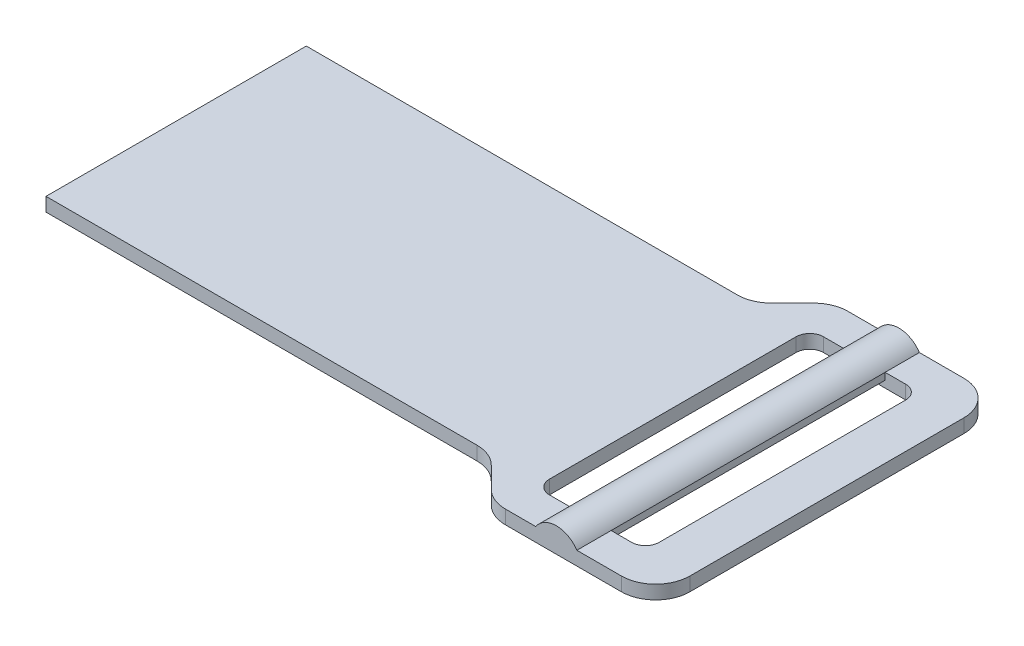
ISO-10303-21;
HEADER;
FILE_DESCRIPTION(('STEP AP214'),'2;1');
FILE_NAME('part.step','',(''),(''),'','','');
FILE_SCHEMA(('AUTOMOTIVE_DESIGN { 1 0 10303 214 1 1 1 1 }'));
ENDSEC;
DATA;
#1=APPLICATION_CONTEXT('core data for automotive mechanical design processes');
#2=APPLICATION_PROTOCOL_DEFINITION('international standard','automotive_design',2000,#1);
#3=PRODUCT_CONTEXT('',#1,'mechanical');
#4=PRODUCT('Part','Part','',(#3));
#5=PRODUCT_RELATED_PRODUCT_CATEGORY('part','',(#4));
#6=PRODUCT_DEFINITION_FORMATION('','',#4);
#7=PRODUCT_DEFINITION_CONTEXT('part definition',#1,'design');
#8=PRODUCT_DEFINITION('design','',#6,#7);
#9=PRODUCT_DEFINITION_SHAPE('','',#8);
#10=(LENGTH_UNIT() NAMED_UNIT(*) SI_UNIT(.MILLI.,.METRE.));
#11=(NAMED_UNIT(*) PLANE_ANGLE_UNIT() SI_UNIT($,.RADIAN.));
#12=(NAMED_UNIT(*) SI_UNIT($,.STERADIAN.) SOLID_ANGLE_UNIT());
#13=UNCERTAINTY_MEASURE_WITH_UNIT(LENGTH_MEASURE(1.E-05),#10,'distance_accuracy_value','');
#14=(GEOMETRIC_REPRESENTATION_CONTEXT(3) GLOBAL_UNCERTAINTY_ASSIGNED_CONTEXT((#13)) GLOBAL_UNIT_ASSIGNED_CONTEXT((#10,
#11,#12)) REPRESENTATION_CONTEXT('',''));
#15=CARTESIAN_POINT('',(0.,0.,0.));
#16=DIRECTION('',(0.,0.,1.));
#17=DIRECTION('',(1.,0.,0.));
#18=AXIS2_PLACEMENT_3D('',#15,#16,#17);
#19=CARTESIAN_POINT('',(0.,2.,0.));
#20=DIRECTION('',(0.,1.,0.));
#21=DIRECTION('',(0.,0.,1.));
#22=AXIS2_PLACEMENT_3D('',#19,#20,#21);
#23=PLANE('',#22);
#24=DIRECTION('',(-1.,0.,0.));
#25=VECTOR('',#24,1.);
#26=CARTESIAN_POINT('',(62.5,2.,-25.));
#27=LINE('',#26,#25);
#28=CARTESIAN_POINT('',(57.5,2.,-25.));
#29=VERTEX_POINT('',#28);
#30=CARTESIAN_POINT('',(51.,2.,-25.));
#31=VERTEX_POINT('',#30);
#32=EDGE_CURVE('E283',#29,#31,#27,.T.);
#33=ORIENTED_EDGE('',*,*,#32,.T.);
#34=DIRECTION('',(0.,0.,-1.));
#35=VECTOR('',#34,1.);
#36=CARTESIAN_POINT('',(51.,2.,25.));
#37=LINE('',#36,#35);
#38=CARTESIAN_POINT('',(51.,2.,-20.));
#39=VERTEX_POINT('',#38);
#40=EDGE_CURVE('E262',#39,#31,#37,.T.);
#41=ORIENTED_EDGE('',*,*,#40,.F.);
#42=DIRECTION('',(-1.,0.,0.));
#43=VECTOR('',#42,1.);
#44=CARTESIAN_POINT('',(56.,2.,-20.));
#45=LINE('',#44,#43);
#46=CARTESIAN_POINT('',(54.,2.,-20.));
#47=VERTEX_POINT('',#46);
#48=EDGE_CURVE('E302',#47,#39,#45,.T.);
#49=ORIENTED_EDGE('',*,*,#48,.F.);
#50=CARTESIAN_POINT('',(54.,2.,-18.));
#51=DIRECTION('',(0.,1.,0.));
#52=DIRECTION('',(0.,0.,1.));
#53=AXIS2_PLACEMENT_3D('',#50,#51,#52);
#54=CIRCLE('',#53,2.);
#55=CARTESIAN_POINT('',(56.,2.,-18.));
#56=VERTEX_POINT('',#55);
#57=EDGE_CURVE('E450',#47,#56,#54,.F.);
#58=ORIENTED_EDGE('',*,*,#57,.T.);
#59=DIRECTION('',(0.,0.,-1.));
#60=VECTOR('',#59,1.);
#61=CARTESIAN_POINT('',(56.,2.,20.));
#62=LINE('',#61,#60);
#63=CARTESIAN_POINT('',(56.,2.,18.));
#64=VERTEX_POINT('',#63);
#65=EDGE_CURVE('E530',#64,#56,#62,.T.);
#66=ORIENTED_EDGE('',*,*,#65,.F.);
#67=CARTESIAN_POINT('',(54.,2.,18.));
#68=DIRECTION('',(0.,1.,0.));
#69=DIRECTION('',(0.,0.,1.));
#70=AXIS2_PLACEMENT_3D('',#67,#68,#69);
#71=CIRCLE('',#70,2.);
#72=CARTESIAN_POINT('',(54.,2.,20.));
#73=VERTEX_POINT('',#72);
#74=EDGE_CURVE('E444',#64,#73,#71,.F.);
#75=ORIENTED_EDGE('',*,*,#74,.T.);
#76=DIRECTION('',(1.,0.,0.));
#77=VECTOR('',#76,1.);
#78=CARTESIAN_POINT('',(56.,2.,20.));
#79=LINE('',#78,#77);
#80=CARTESIAN_POINT('',(51.,2.,20.));
#81=VERTEX_POINT('',#80);
#82=EDGE_CURVE('E257',#81,#73,#79,.T.);
#83=ORIENTED_EDGE('',*,*,#82,.F.);
#84=CARTESIAN_POINT('',(51.,2.,25.));
#85=VERTEX_POINT('',#84);
#86=EDGE_CURVE('E240',#85,#81,#37,.T.);
#87=ORIENTED_EDGE('',*,*,#86,.F.);
#88=DIRECTION('',(1.,0.,0.));
#89=VECTOR('',#88,1.);
#90=CARTESIAN_POINT('',(38.5,2.,25.));
#91=LINE('',#90,#89);
#92=CARTESIAN_POINT('',(57.5,2.,25.));
#93=VERTEX_POINT('',#92);
#94=EDGE_CURVE('E254',#85,#93,#91,.T.);
#95=ORIENTED_EDGE('',*,*,#94,.T.);
#96=CARTESIAN_POINT('',(57.5,2.,20.));
#97=DIRECTION('',(0.,1.,0.));
#98=DIRECTION('',(0.,0.,1.));
#99=AXIS2_PLACEMENT_3D('',#96,#97,#98);
#100=CIRCLE('',#99,5.);
#101=CARTESIAN_POINT('',(62.5,2.,20.));
#102=VERTEX_POINT('',#101);
#103=EDGE_CURVE('E363',#93,#102,#100,.T.);
#104=ORIENTED_EDGE('',*,*,#103,.T.);
#105=DIRECTION('',(0.,0.,-1.));
#106=VECTOR('',#105,1.);
#107=CARTESIAN_POINT('',(62.5,2.,25.));
#108=LINE('',#107,#106);
#109=CARTESIAN_POINT('',(62.5,2.,-20.));
#110=VERTEX_POINT('',#109);
#111=EDGE_CURVE('E273',#102,#110,#108,.T.);
#112=ORIENTED_EDGE('',*,*,#111,.T.);
#113=CARTESIAN_POINT('',(57.5,2.,-20.));
#114=DIRECTION('',(0.,1.,0.));
#115=DIRECTION('',(0.,0.,1.));
#116=AXIS2_PLACEMENT_3D('',#113,#114,#115);
#117=CIRCLE('',#116,5.);
#118=EDGE_CURVE('E366',#110,#29,#117,.T.);
#119=ORIENTED_EDGE('',*,*,#118,.T.);
#120=EDGE_LOOP('',(#33,#41,#49,#58,#66,#75,#83,#87,#95,#104,#112,#119));
#121=FACE_BOUND('',#120,.T.);
#122=ADVANCED_FACE('F39',(#121),#23,.T.);
#123=CARTESIAN_POINT('',(40.5710678118655,2.,25.));
#124=VERTEX_POINT('',#123);
#125=CARTESIAN_POINT('',(45.,2.,25.));
#126=VERTEX_POINT('',#125);
#127=EDGE_CURVE('E268',#124,#126,#91,.T.);
#128=ORIENTED_EDGE('',*,*,#127,.T.);
#129=DIRECTION('',(0.,0.,-1.));
#130=VECTOR('',#129,1.);
#131=CARTESIAN_POINT('',(45.,2.,25.));
#132=LINE('',#131,#130);
#133=CARTESIAN_POINT('',(45.,2.,20.));
#134=VERTEX_POINT('',#133);
#135=EDGE_CURVE('E243',#126,#134,#132,.T.);
#136=ORIENTED_EDGE('',*,*,#135,.T.);
#137=CARTESIAN_POINT('',(42.,2.,20.));
#138=VERTEX_POINT('',#137);
#139=EDGE_CURVE('E526',#138,#134,#79,.T.);
#140=ORIENTED_EDGE('',*,*,#139,.F.);
#141=CARTESIAN_POINT('',(42.,2.,18.));
#142=DIRECTION('',(0.,1.,0.));
#143=DIRECTION('',(0.,0.,1.));
#144=AXIS2_PLACEMENT_3D('',#141,#142,#143);
#145=CIRCLE('',#144,2.);
#146=CARTESIAN_POINT('',(40.,2.,18.));
#147=VERTEX_POINT('',#146);
#148=EDGE_CURVE('E456',#138,#147,#145,.F.);
#149=ORIENTED_EDGE('',*,*,#148,.T.);
#150=DIRECTION('',(0.,0.,1.));
#151=VECTOR('',#150,1.);
#152=CARTESIAN_POINT('',(40.,2.,20.));
#153=LINE('',#152,#151);
#154=CARTESIAN_POINT('',(40.,2.,-18.));
#155=VERTEX_POINT('',#154);
#156=EDGE_CURVE('E521',#155,#147,#153,.T.);
#157=ORIENTED_EDGE('',*,*,#156,.F.);
#158=CARTESIAN_POINT('',(42.,2.,-18.));
#159=DIRECTION('',(0.,1.,0.));
#160=DIRECTION('',(0.,0.,1.));
#161=AXIS2_PLACEMENT_3D('',#158,#159,#160);
#162=CIRCLE('',#161,2.);
#163=CARTESIAN_POINT('',(42.,2.,-20.));
#164=VERTEX_POINT('',#163);
#165=EDGE_CURVE('E462',#155,#164,#162,.F.);
#166=ORIENTED_EDGE('',*,*,#165,.T.);
#167=CARTESIAN_POINT('',(45.,2.,-20.));
#168=VERTEX_POINT('',#167);
#169=EDGE_CURVE('E534',#168,#164,#45,.T.);
#170=ORIENTED_EDGE('',*,*,#169,.F.);
#171=CARTESIAN_POINT('',(45.,2.,-25.));
#172=VERTEX_POINT('',#171);
#173=EDGE_CURVE('E493',#168,#172,#132,.T.);
#174=ORIENTED_EDGE('',*,*,#173,.T.);
#175=CARTESIAN_POINT('',(40.5710678118655,2.,-25.));
#176=VERTEX_POINT('',#175);
#177=EDGE_CURVE('E282',#172,#176,#27,.T.);
#178=ORIENTED_EDGE('',*,*,#177,.T.);
#179=CARTESIAN_POINT('',(40.5710678118655,2.,-20.));
#180=DIRECTION('',(0.,1.,0.));
#181=DIRECTION('',(0.,0.,1.));
#182=AXIS2_PLACEMENT_3D('',#179,#180,#181);
#183=CIRCLE('',#182,5.);
#184=CARTESIAN_POINT('',(37.0355339059327,2.,-23.5355339059327));
#185=VERTEX_POINT('',#184);
#186=EDGE_CURVE('E369',#176,#185,#183,.T.);
#187=ORIENTED_EDGE('',*,*,#186,.T.);
#188=DIRECTION('',(-0.707106781186547,0.,0.707106781186548));
#189=VECTOR('',#188,1.);
#190=CARTESIAN_POINT('',(38.5,2.,-25.));
#191=LINE('',#190,#189);
#192=CARTESIAN_POINT('',(33.9644660940673,2.,-20.4644660940673));
#193=VERTEX_POINT('',#192);
#194=EDGE_CURVE('E286',#185,#193,#191,.T.);
#195=ORIENTED_EDGE('',*,*,#194,.T.);
#196=CARTESIAN_POINT('',(30.4289321881345,2.,-24.));
#197=DIRECTION('',(0.,1.,0.));
#198=DIRECTION('',(0.,0.,1.));
#199=AXIS2_PLACEMENT_3D('',#196,#197,#198);
#200=CIRCLE('',#199,5.);
#201=CARTESIAN_POINT('',(30.4289321881345,2.,-19.));
#202=VERTEX_POINT('',#201);
#203=EDGE_CURVE('E410',#193,#202,#200,.F.);
#204=ORIENTED_EDGE('',*,*,#203,.T.);
#205=DIRECTION('',(-1.,0.,0.));
#206=VECTOR('',#205,1.);
#207=CARTESIAN_POINT('',(-32.5,2.,-19.));
#208=LINE('',#207,#206);
#209=CARTESIAN_POINT('',(-32.5,2.,-19.));
#210=VERTEX_POINT('',#209);
#211=EDGE_CURVE('E290',#202,#210,#208,.T.);
#212=ORIENTED_EDGE('',*,*,#211,.T.);
#213=DIRECTION('',(0.,0.,1.));
#214=VECTOR('',#213,1.);
#215=CARTESIAN_POINT('',(-32.5,2.,-19.));
#216=LINE('',#215,#214);
#217=CARTESIAN_POINT('',(-32.5,2.,19.));
#218=VERTEX_POINT('',#217);
#219=EDGE_CURVE('E293',#210,#218,#216,.T.);
#220=ORIENTED_EDGE('',*,*,#219,.T.);
#221=DIRECTION('',(1.,0.,0.));
#222=VECTOR('',#221,1.);
#223=CARTESIAN_POINT('',(-32.5,2.,19.));
#224=LINE('',#223,#222);
#225=CARTESIAN_POINT('',(30.4289321881345,2.,19.));
#226=VERTEX_POINT('',#225);
#227=EDGE_CURVE('E275',#218,#226,#224,.T.);
#228=ORIENTED_EDGE('',*,*,#227,.T.);
#229=CARTESIAN_POINT('',(30.4289321881345,2.,24.));
#230=DIRECTION('',(0.,1.,0.));
#231=DIRECTION('',(0.,0.,1.));
#232=AXIS2_PLACEMENT_3D('',#229,#230,#231);
#233=CIRCLE('',#232,5.);
#234=CARTESIAN_POINT('',(33.9644660940673,2.,20.4644660940673));
#235=VERTEX_POINT('',#234);
#236=EDGE_CURVE('E404',#226,#235,#233,.F.);
#237=ORIENTED_EDGE('',*,*,#236,.T.);
#238=DIRECTION('',(0.707106781186547,0.,0.707106781186548));
#239=VECTOR('',#238,1.);
#240=CARTESIAN_POINT('',(32.5,2.,19.));
#241=LINE('',#240,#239);
#242=CARTESIAN_POINT('',(37.0355339059327,2.,23.5355339059327));
#243=VERTEX_POINT('',#242);
#244=EDGE_CURVE('E269',#235,#243,#241,.T.);
#245=ORIENTED_EDGE('',*,*,#244,.T.);
#246=CARTESIAN_POINT('',(40.5710678118655,2.,20.));
#247=DIRECTION('',(0.,1.,0.));
#248=DIRECTION('',(0.,0.,1.));
#249=AXIS2_PLACEMENT_3D('',#246,#247,#248);
#250=CIRCLE('',#249,5.);
#251=EDGE_CURVE('E372',#243,#124,#250,.T.);
#252=ORIENTED_EDGE('',*,*,#251,.T.);
#253=EDGE_LOOP('',(#128,#136,#140,#149,#157,#166,#170,#174,#178,#187,#195,#204,#212,#220,#228,
#237,#245,#252));
#254=FACE_BOUND('',#253,.T.);
#255=ADVANCED_FACE('F556',(#254),#23,.T.);
#256=CARTESIAN_POINT('',(56.,2.,20.));
#257=DIRECTION('',(0.,0.,-1.));
#258=DIRECTION('',(-1.,0.,0.));
#259=AXIS2_PLACEMENT_3D('',#256,#257,#258);
#260=PLANE('',#259);
#261=DIRECTION('',(1.,0.,0.));
#262=VECTOR('',#261,1.);
#263=CARTESIAN_POINT('',(56.,0.,20.));
#264=LINE('',#263,#262);
#265=CARTESIAN_POINT('',(50.,0.,20.));
#266=VERTEX_POINT('',#265);
#267=CARTESIAN_POINT('',(54.,0.,20.));
#268=VERTEX_POINT('',#267);
#269=EDGE_CURVE('E540',#266,#268,#264,.T.);
#270=ORIENTED_EDGE('',*,*,#269,.F.);
#271=DIRECTION('',(0.707106781186548,0.707106781186547,0.));
#272=VECTOR('',#271,1.);
#273=CARTESIAN_POINT('',(54.,4.,20.));
#274=LINE('',#273,#272);
#275=CARTESIAN_POINT('',(51.,1.,20.));
#276=VERTEX_POINT('',#275);
#277=EDGE_CURVE('E512',#266,#276,#274,.T.);
#278=ORIENTED_EDGE('',*,*,#277,.T.);
#279=DIRECTION('',(0.,1.,0.));
#280=VECTOR('',#279,1.);
#281=CARTESIAN_POINT('',(51.,2.,20.));
#282=LINE('',#281,#280);
#283=EDGE_CURVE('E509',#276,#81,#282,.T.);
#284=ORIENTED_EDGE('',*,*,#283,.T.);
#285=ORIENTED_EDGE('',*,*,#82,.T.);
#286=DIRECTION('',(0.,-1.,0.));
#287=VECTOR('',#286,1.);
#288=CARTESIAN_POINT('',(54.,0.,20.));
#289=LINE('',#288,#287);
#290=EDGE_CURVE('E416',#73,#268,#289,.T.);
#291=ORIENTED_EDGE('',*,*,#290,.T.);
#292=EDGE_LOOP('',(#270,#278,#284,#285,#291));
#293=FACE_BOUND('',#292,.T.);
#294=ADVANCED_FACE('F614',(#293),#260,.T.);
#295=DIRECTION('',(0.,-1.,0.));
#296=VECTOR('',#295,1.);
#297=CARTESIAN_POINT('',(45.,2.,20.));
#298=LINE('',#297,#296);
#299=CARTESIAN_POINT('',(45.,1.,20.));
#300=VERTEX_POINT('',#299);
#301=EDGE_CURVE('E505',#134,#300,#298,.T.);
#302=ORIENTED_EDGE('',*,*,#301,.T.);
#303=DIRECTION('',(0.707106781186548,-0.707106781186547,0.));
#304=VECTOR('',#303,1.);
#305=CARTESIAN_POINT('',(50.,-4.00000000000001,20.));
#306=LINE('',#305,#304);
#307=CARTESIAN_POINT('',(46.,0.,20.));
#308=VERTEX_POINT('',#307);
#309=EDGE_CURVE('E516',#300,#308,#306,.T.);
#310=ORIENTED_EDGE('',*,*,#309,.T.);
#311=CARTESIAN_POINT('',(42.,0.,20.));
#312=VERTEX_POINT('',#311);
#313=EDGE_CURVE('E541',#312,#308,#264,.T.);
#314=ORIENTED_EDGE('',*,*,#313,.F.);
#315=DIRECTION('',(0.,-1.,0.));
#316=VECTOR('',#315,1.);
#317=CARTESIAN_POINT('',(42.,2.,20.));
#318=LINE('',#317,#316);
#319=EDGE_CURVE('E413',#312,#138,#318,.F.);
#320=ORIENTED_EDGE('',*,*,#319,.T.);
#321=ORIENTED_EDGE('',*,*,#139,.T.);
#322=EDGE_LOOP('',(#302,#310,#314,#320,#321));
#323=FACE_BOUND('',#322,.T.);
#324=ADVANCED_FACE('F580',(#323),#260,.T.);
#325=CARTESIAN_POINT('',(56.,2.,-20.));
#326=DIRECTION('',(0.,0.,1.));
#327=DIRECTION('',(1.,0.,0.));
#328=AXIS2_PLACEMENT_3D('',#325,#326,#327);
#329=PLANE('',#328);
#330=DIRECTION('',(0.,-1.,0.));
#331=VECTOR('',#330,1.);
#332=CARTESIAN_POINT('',(51.,2.,-20.));
#333=LINE('',#332,#331);
#334=CARTESIAN_POINT('',(51.,1.,-20.));
#335=VERTEX_POINT('',#334);
#336=EDGE_CURVE('E48',#39,#335,#333,.T.);
#337=ORIENTED_EDGE('',*,*,#336,.T.);
#338=DIRECTION('',(-0.707106781186548,-0.707106781186547,0.));
#339=VECTOR('',#338,1.);
#340=CARTESIAN_POINT('',(54.,4.,-20.));
#341=LINE('',#340,#339);
#342=CARTESIAN_POINT('',(50.,0.,-20.));
#343=VERTEX_POINT('',#342);
#344=EDGE_CURVE('E11',#335,#343,#341,.T.);
#345=ORIENTED_EDGE('',*,*,#344,.T.);
#346=DIRECTION('',(-1.,0.,0.));
#347=VECTOR('',#346,1.);
#348=CARTESIAN_POINT('',(56.,0.,-20.));
#349=LINE('',#348,#347);
#350=CARTESIAN_POINT('',(54.,0.,-20.));
#351=VERTEX_POINT('',#350);
#352=EDGE_CURVE('E525',#351,#343,#349,.T.);
#353=ORIENTED_EDGE('',*,*,#352,.F.);
#354=DIRECTION('',(0.,-1.,0.));
#355=VECTOR('',#354,1.);
#356=CARTESIAN_POINT('',(54.,2.,-20.));
#357=LINE('',#356,#355);
#358=EDGE_CURVE('E431',#351,#47,#357,.F.);
#359=ORIENTED_EDGE('',*,*,#358,.T.);
#360=ORIENTED_EDGE('',*,*,#48,.T.);
#361=EDGE_LOOP('',(#337,#345,#353,#359,#360));
#362=FACE_BOUND('',#361,.T.);
#363=ADVANCED_FACE('F477',(#362),#329,.T.);
#364=CARTESIAN_POINT('',(46.,0.,-20.));
#365=VERTEX_POINT('',#364);
#366=CARTESIAN_POINT('',(42.,0.,-20.));
#367=VERTEX_POINT('',#366);
#368=EDGE_CURVE('E549',#365,#367,#349,.T.);
#369=ORIENTED_EDGE('',*,*,#368,.F.);
#370=DIRECTION('',(-0.707106781186548,0.707106781186547,0.));
#371=VECTOR('',#370,1.);
#372=CARTESIAN_POINT('',(50.,-4.00000000000001,-20.));
#373=LINE('',#372,#371);
#374=CARTESIAN_POINT('',(45.,1.,-20.));
#375=VERTEX_POINT('',#374);
#376=EDGE_CURVE('E470',#365,#375,#373,.T.);
#377=ORIENTED_EDGE('',*,*,#376,.T.);
#378=DIRECTION('',(0.,1.,0.));
#379=VECTOR('',#378,1.);
#380=CARTESIAN_POINT('',(45.,2.,-20.));
#381=LINE('',#380,#379);
#382=EDGE_CURVE('E466',#375,#168,#381,.T.);
#383=ORIENTED_EDGE('',*,*,#382,.T.);
#384=ORIENTED_EDGE('',*,*,#169,.T.);
#385=DIRECTION('',(0.,-1.,0.));
#386=VECTOR('',#385,1.);
#387=CARTESIAN_POINT('',(42.,0.,-20.));
#388=LINE('',#387,#386);
#389=EDGE_CURVE('E427',#164,#367,#388,.T.);
#390=ORIENTED_EDGE('',*,*,#389,.T.);
#391=EDGE_LOOP('',(#369,#377,#383,#384,#390));
#392=FACE_BOUND('',#391,.T.);
#393=ADVANCED_FACE('F641',(#392),#329,.T.);
#394=CARTESIAN_POINT('',(0.,0.,0.));
#395=DIRECTION('',(0.,1.,0.));
#396=DIRECTION('',(0.,0.,1.));
#397=AXIS2_PLACEMENT_3D('',#394,#395,#396);
#398=PLANE('',#397);
#399=ORIENTED_EDGE('',*,*,#313,.T.);
#400=DIRECTION('',(0.,0.,-1.));
#401=VECTOR('',#400,1.);
#402=CARTESIAN_POINT('',(46.,0.,25.));
#403=LINE('',#402,#401);
#404=EDGE_CURVE('E501',#308,#365,#403,.T.);
#405=ORIENTED_EDGE('',*,*,#404,.T.);
#406=ORIENTED_EDGE('',*,*,#368,.T.);
#407=CARTESIAN_POINT('',(42.,0.,-18.));
#408=DIRECTION('',(0.,1.,0.));
#409=DIRECTION('',(0.,0.,1.));
#410=AXIS2_PLACEMENT_3D('',#407,#408,#409);
#411=CIRCLE('',#410,2.);
#412=CARTESIAN_POINT('',(40.,0.,-18.));
#413=VERTEX_POINT('',#412);
#414=EDGE_CURVE('E459',#367,#413,#411,.T.);
#415=ORIENTED_EDGE('',*,*,#414,.T.);
#416=DIRECTION('',(0.,0.,1.));
#417=VECTOR('',#416,1.);
#418=CARTESIAN_POINT('',(40.,0.,20.));
#419=LINE('',#418,#417);
#420=CARTESIAN_POINT('',(40.,0.,18.));
#421=VERTEX_POINT('',#420);
#422=EDGE_CURVE('E520',#413,#421,#419,.T.);
#423=ORIENTED_EDGE('',*,*,#422,.T.);
#424=CARTESIAN_POINT('',(42.,0.,18.));
#425=DIRECTION('',(0.,1.,0.));
#426=DIRECTION('',(0.,0.,1.));
#427=AXIS2_PLACEMENT_3D('',#424,#425,#426);
#428=CIRCLE('',#427,2.);
#429=EDGE_CURVE('E453',#421,#312,#428,.T.);
#430=ORIENTED_EDGE('',*,*,#429,.T.);
#431=EDGE_LOOP('',(#399,#405,#406,#415,#423,#430));
#432=FACE_BOUND('',#431,.T.);
#433=ORIENTED_EDGE('',*,*,#352,.T.);
#434=DIRECTION('',(0.,0.,-1.));
#435=VECTOR('',#434,1.);
#436=CARTESIAN_POINT('',(50.,0.,25.));
#437=LINE('',#436,#435);
#438=EDGE_CURVE('E498',#266,#343,#437,.T.);
#439=ORIENTED_EDGE('',*,*,#438,.F.);
#440=ORIENTED_EDGE('',*,*,#269,.T.);
#441=CARTESIAN_POINT('',(54.,0.,18.));
#442=DIRECTION('',(0.,1.,0.));
#443=DIRECTION('',(0.,0.,1.));
#444=AXIS2_PLACEMENT_3D('',#441,#442,#443);
#445=CIRCLE('',#444,2.);
#446=CARTESIAN_POINT('',(56.,0.,18.));
#447=VERTEX_POINT('',#446);
#448=EDGE_CURVE('E441',#268,#447,#445,.T.);
#449=ORIENTED_EDGE('',*,*,#448,.T.);
#450=DIRECTION('',(0.,0.,-1.));
#451=VECTOR('',#450,1.);
#452=CARTESIAN_POINT('',(56.,0.,20.));
#453=LINE('',#452,#451);
#454=CARTESIAN_POINT('',(56.,0.,-18.));
#455=VERTEX_POINT('',#454);
#456=EDGE_CURVE('E545',#447,#455,#453,.T.);
#457=ORIENTED_EDGE('',*,*,#456,.T.);
#458=CARTESIAN_POINT('',(54.,0.,-18.));
#459=DIRECTION('',(0.,1.,0.));
#460=DIRECTION('',(0.,0.,1.));
#461=AXIS2_PLACEMENT_3D('',#458,#459,#460);
#462=CIRCLE('',#461,2.);
#463=EDGE_CURVE('E447',#455,#351,#462,.T.);
#464=ORIENTED_EDGE('',*,*,#463,.T.);
#465=EDGE_LOOP('',(#433,#439,#440,#449,#457,#464));
#466=FACE_BOUND('',#465,.T.);
#467=CARTESIAN_POINT('',(40.5710678118655,0.,-20.));
#468=DIRECTION('',(0.,1.,0.));
#469=DIRECTION('',(0.,0.,1.));
#470=AXIS2_PLACEMENT_3D('',#467,#468,#469);
#471=CIRCLE('',#470,5.);
#472=CARTESIAN_POINT('',(37.0355339059327,0.,-23.5355339059327));
#473=VERTEX_POINT('',#472);
#474=CARTESIAN_POINT('',(40.5710678118655,0.,-25.));
#475=VERTEX_POINT('',#474);
#476=EDGE_CURVE('E356',#473,#475,#471,.F.);
#477=ORIENTED_EDGE('',*,*,#476,.T.);
#478=DIRECTION('',(-1.,0.,0.));
#479=VECTOR('',#478,1.);
#480=CARTESIAN_POINT('',(62.5,0.,-25.));
#481=LINE('',#480,#479);
#482=CARTESIAN_POINT('',(57.5,0.,-25.));
#483=VERTEX_POINT('',#482);
#484=EDGE_CURVE('E313',#483,#475,#481,.T.);
#485=ORIENTED_EDGE('',*,*,#484,.F.);
#486=CARTESIAN_POINT('',(57.5,0.,-20.));
#487=DIRECTION('',(0.,1.,0.));
#488=DIRECTION('',(0.,0.,1.));
#489=AXIS2_PLACEMENT_3D('',#486,#487,#488);
#490=CIRCLE('',#489,5.);
#491=CARTESIAN_POINT('',(62.5,0.,-20.));
#492=VERTEX_POINT('',#491);
#493=EDGE_CURVE('E353',#483,#492,#490,.F.);
#494=ORIENTED_EDGE('',*,*,#493,.T.);
#495=DIRECTION('',(0.,0.,-1.));
#496=VECTOR('',#495,1.);
#497=CARTESIAN_POINT('',(62.5,0.,25.));
#498=LINE('',#497,#496);
#499=CARTESIAN_POINT('',(62.5,0.,20.));
#500=VERTEX_POINT('',#499);
#501=EDGE_CURVE('E309',#500,#492,#498,.T.);
#502=ORIENTED_EDGE('',*,*,#501,.F.);
#503=CARTESIAN_POINT('',(57.5,0.,20.));
#504=DIRECTION('',(0.,1.,0.));
#505=DIRECTION('',(0.,0.,1.));
#506=AXIS2_PLACEMENT_3D('',#503,#504,#505);
#507=CIRCLE('',#506,5.);
#508=CARTESIAN_POINT('',(57.5,0.,25.));
#509=VERTEX_POINT('',#508);
#510=EDGE_CURVE('E349',#500,#509,#507,.F.);
#511=ORIENTED_EDGE('',*,*,#510,.T.);
#512=DIRECTION('',(1.,0.,0.));
#513=VECTOR('',#512,1.);
#514=CARTESIAN_POINT('',(38.5,0.,25.));
#515=LINE('',#514,#513);
#516=CARTESIAN_POINT('',(40.5710678118655,0.,25.));
#517=VERTEX_POINT('',#516);
#518=EDGE_CURVE('E306',#517,#509,#515,.T.);
#519=ORIENTED_EDGE('',*,*,#518,.F.);
#520=CARTESIAN_POINT('',(40.5710678118655,0.,20.));
#521=DIRECTION('',(0.,1.,0.));
#522=DIRECTION('',(0.,0.,1.));
#523=AXIS2_PLACEMENT_3D('',#520,#521,#522);
#524=CIRCLE('',#523,5.);
#525=CARTESIAN_POINT('',(37.0355339059327,0.,23.5355339059327));
#526=VERTEX_POINT('',#525);
#527=EDGE_CURVE('E360',#517,#526,#524,.F.);
#528=ORIENTED_EDGE('',*,*,#527,.T.);
#529=DIRECTION('',(0.707106781186547,0.,0.707106781186548));
#530=VECTOR('',#529,1.);
#531=CARTESIAN_POINT('',(32.5,0.,19.));
#532=LINE('',#531,#530);
#533=CARTESIAN_POINT('',(33.9644660940673,0.,20.4644660940673));
#534=VERTEX_POINT('',#533);
#535=EDGE_CURVE('E301',#534,#526,#532,.T.);
#536=ORIENTED_EDGE('',*,*,#535,.F.);
#537=CARTESIAN_POINT('',(30.4289321881345,0.,24.));
#538=DIRECTION('',(0.,1.,0.));
#539=DIRECTION('',(0.,0.,1.));
#540=AXIS2_PLACEMENT_3D('',#537,#538,#539);
#541=CIRCLE('',#540,5.);
#542=CARTESIAN_POINT('',(30.4289321881345,0.,19.));
#543=VERTEX_POINT('',#542);
#544=EDGE_CURVE('E401',#534,#543,#541,.T.);
#545=ORIENTED_EDGE('',*,*,#544,.T.);
#546=DIRECTION('',(1.,0.,0.));
#547=VECTOR('',#546,1.);
#548=CARTESIAN_POINT('',(-32.5,0.,19.));
#549=LINE('',#548,#547);
#550=CARTESIAN_POINT('',(-32.5,0.,19.));
#551=VERTEX_POINT('',#550);
#552=EDGE_CURVE('E297',#551,#543,#549,.T.);
#553=ORIENTED_EDGE('',*,*,#552,.F.);
#554=DIRECTION('',(0.,0.,1.));
#555=VECTOR('',#554,1.);
#556=CARTESIAN_POINT('',(-32.5,0.,-19.));
#557=LINE('',#556,#555);
#558=CARTESIAN_POINT('',(-32.5,0.,-19.));
#559=VERTEX_POINT('',#558);
#560=EDGE_CURVE('E323',#559,#551,#557,.T.);
#561=ORIENTED_EDGE('',*,*,#560,.F.);
#562=DIRECTION('',(-1.,0.,0.));
#563=VECTOR('',#562,1.);
#564=CARTESIAN_POINT('',(-32.5,0.,-19.));
#565=LINE('',#564,#563);
#566=CARTESIAN_POINT('',(30.4289321881345,0.,-19.));
#567=VERTEX_POINT('',#566);
#568=EDGE_CURVE('E320',#567,#559,#565,.T.);
#569=ORIENTED_EDGE('',*,*,#568,.F.);
#570=CARTESIAN_POINT('',(30.4289321881345,0.,-24.));
#571=DIRECTION('',(0.,1.,0.));
#572=DIRECTION('',(0.,0.,1.));
#573=AXIS2_PLACEMENT_3D('',#570,#571,#572);
#574=CIRCLE('',#573,5.);
#575=CARTESIAN_POINT('',(33.9644660940673,0.,-20.4644660940673));
#576=VERTEX_POINT('',#575);
#577=EDGE_CURVE('E407',#567,#576,#574,.T.);
#578=ORIENTED_EDGE('',*,*,#577,.T.);
#579=DIRECTION('',(-0.707106781186547,0.,0.707106781186548));
#580=VECTOR('',#579,1.);
#581=CARTESIAN_POINT('',(38.5,0.,-25.));
#582=LINE('',#581,#580);
#583=EDGE_CURVE('E316',#473,#576,#582,.T.);
#584=ORIENTED_EDGE('',*,*,#583,.F.);
#585=EDGE_LOOP('',(#477,#485,#494,#502,#511,#519,#528,#536,#545,#553,#561,#569,#578,#584));
#586=FACE_BOUND('',#585,.T.);
#587=ADVANCED_FACE('F570',(#432,#466,#586),#398,.F.);
#588=CARTESIAN_POINT('',(-32.5,2.,19.));
#589=DIRECTION('',(0.,0.,-1.));
#590=DIRECTION('',(-1.,0.,0.));
#591=AXIS2_PLACEMENT_3D('',#588,#589,#590);
#592=PLANE('',#591);
#593=ORIENTED_EDGE('',*,*,#552,.T.);
#594=DIRECTION('',(0.,-1.,0.));
#595=VECTOR('',#594,1.);
#596=CARTESIAN_POINT('',(30.4289321881345,2.,19.));
#597=LINE('',#596,#595);
#598=EDGE_CURVE('E340',#543,#226,#597,.F.);
#599=ORIENTED_EDGE('',*,*,#598,.T.);
#600=ORIENTED_EDGE('',*,*,#227,.F.);
#601=DIRECTION('',(0.,-1.,0.));
#602=VECTOR('',#601,1.);
#603=CARTESIAN_POINT('',(-32.5,2.,19.));
#604=LINE('',#603,#602);
#605=EDGE_CURVE('E296',#218,#551,#604,.T.);
#606=ORIENTED_EDGE('',*,*,#605,.T.);
#607=EDGE_LOOP('',(#593,#599,#600,#606));
#608=FACE_BOUND('',#607,.T.);
#609=ADVANCED_FACE('F640',(#608),#592,.F.);
#610=CARTESIAN_POINT('',(32.5,2.,19.));
#611=DIRECTION('',(0.707106781186548,0.,-0.707106781186547));
#612=DIRECTION('',(-0.707106781186547,0.,-0.707106781186548));
#613=AXIS2_PLACEMENT_3D('',#610,#611,#612);
#614=PLANE('',#613);
#615=ORIENTED_EDGE('',*,*,#244,.F.);
#616=DIRECTION('',(0.,-1.,0.));
#617=VECTOR('',#616,1.);
#618=CARTESIAN_POINT('',(33.9644660940673,0.,20.4644660940673));
#619=LINE('',#618,#617);
#620=EDGE_CURVE('E336',#235,#534,#619,.T.);
#621=ORIENTED_EDGE('',*,*,#620,.T.);
#622=ORIENTED_EDGE('',*,*,#535,.T.);
#623=DIRECTION('',(0.,-1.,0.));
#624=VECTOR('',#623,1.);
#625=CARTESIAN_POINT('',(37.0355339059327,2.,23.5355339059327));
#626=LINE('',#625,#624);
#627=EDGE_CURVE('E333',#526,#243,#626,.F.);
#628=ORIENTED_EDGE('',*,*,#627,.T.);
#629=EDGE_LOOP('',(#615,#621,#622,#628));
#630=FACE_BOUND('',#629,.T.);
#631=ADVANCED_FACE('F567',(#630),#614,.F.);
#632=CARTESIAN_POINT('',(38.5,2.,25.));
#633=DIRECTION('',(0.,0.,-1.));
#634=DIRECTION('',(-1.,0.,0.));
#635=AXIS2_PLACEMENT_3D('',#632,#633,#634);
#636=PLANE('',#635);
#637=ORIENTED_EDGE('',*,*,#518,.T.);
#638=DIRECTION('',(0.,-1.,0.));
#639=VECTOR('',#638,1.);
#640=CARTESIAN_POINT('',(57.5,2.,25.));
#641=LINE('',#640,#639);
#642=EDGE_CURVE('E265',#509,#93,#641,.F.);
#643=ORIENTED_EDGE('',*,*,#642,.T.);
#644=ORIENTED_EDGE('',*,*,#94,.F.);
#645=CARTESIAN_POINT('',(48.,0.,25.));
#646=DIRECTION('',(0.,0.,1.));
#647=DIRECTION('',(1.,0.,0.));
#648=AXIS2_PLACEMENT_3D('',#645,#646,#647);
#649=CIRCLE('',#648,3.60555127546399);
#650=EDGE_CURVE('E236',#85,#126,#649,.T.);
#651=ORIENTED_EDGE('',*,*,#650,.T.);
#652=ORIENTED_EDGE('',*,*,#127,.F.);
#653=DIRECTION('',(0.,-1.,0.));
#654=VECTOR('',#653,1.);
#655=CARTESIAN_POINT('',(40.5710678118655,2.,25.));
#656=LINE('',#655,#654);
#657=EDGE_CURVE('E345',#124,#517,#656,.T.);
#658=ORIENTED_EDGE('',*,*,#657,.T.);
#659=EDGE_LOOP('',(#637,#643,#644,#651,#652,#658));
#660=FACE_BOUND('',#659,.T.);
#661=ADVANCED_FACE('F263',(#660),#636,.F.);
#662=CARTESIAN_POINT('',(62.5,2.,25.));
#663=DIRECTION('',(-1.,0.,0.));
#664=DIRECTION('',(0.,0.,1.));
#665=AXIS2_PLACEMENT_3D('',#662,#663,#664);
#666=PLANE('',#665);
#667=ORIENTED_EDGE('',*,*,#501,.T.);
#668=DIRECTION('',(0.,-1.,0.));
#669=VECTOR('',#668,1.);
#670=CARTESIAN_POINT('',(62.5,2.,-20.));
#671=LINE('',#670,#669);
#672=EDGE_CURVE('E398',#492,#110,#671,.F.);
#673=ORIENTED_EDGE('',*,*,#672,.T.);
#674=ORIENTED_EDGE('',*,*,#111,.F.);
#675=DIRECTION('',(0.,-1.,0.));
#676=VECTOR('',#675,1.);
#677=CARTESIAN_POINT('',(62.5,2.,20.));
#678=LINE('',#677,#676);
#679=EDGE_CURVE('E394',#102,#500,#678,.T.);
#680=ORIENTED_EDGE('',*,*,#679,.T.);
#681=EDGE_LOOP('',(#667,#673,#674,#680));
#682=FACE_BOUND('',#681,.T.);
#683=ADVANCED_FACE('F658',(#682),#666,.F.);
#684=CARTESIAN_POINT('',(62.5,2.,-25.));
#685=DIRECTION('',(0.,0.,1.));
#686=DIRECTION('',(1.,0.,0.));
#687=AXIS2_PLACEMENT_3D('',#684,#685,#686);
#688=PLANE('',#687);
#689=ORIENTED_EDGE('',*,*,#484,.T.);
#690=DIRECTION('',(0.,-1.,0.));
#691=VECTOR('',#690,1.);
#692=CARTESIAN_POINT('',(40.5710678118655,2.,-25.));
#693=LINE('',#692,#691);
#694=EDGE_CURVE('E390',#475,#176,#693,.F.);
#695=ORIENTED_EDGE('',*,*,#694,.T.);
#696=ORIENTED_EDGE('',*,*,#177,.F.);
#697=CARTESIAN_POINT('',(48.,0.,-25.));
#698=DIRECTION('',(0.,0.,1.));
#699=DIRECTION('',(1.,0.,0.));
#700=AXIS2_PLACEMENT_3D('',#697,#698,#699);
#701=CIRCLE('',#700,3.60555127546399);
#702=EDGE_CURVE('E249',#31,#172,#701,.T.);
#703=ORIENTED_EDGE('',*,*,#702,.F.);
#704=ORIENTED_EDGE('',*,*,#32,.F.);
#705=DIRECTION('',(0.,-1.,0.));
#706=VECTOR('',#705,1.);
#707=CARTESIAN_POINT('',(57.5,2.,-25.));
#708=LINE('',#707,#706);
#709=EDGE_CURVE('E386',#29,#483,#708,.T.);
#710=ORIENTED_EDGE('',*,*,#709,.T.);
#711=EDGE_LOOP('',(#689,#695,#696,#703,#704,#710));
#712=FACE_BOUND('',#711,.T.);
#713=ADVANCED_FACE('F654',(#712),#688,.F.);
#714=CARTESIAN_POINT('',(38.5,2.,-25.));
#715=DIRECTION('',(0.707106781186548,0.,0.707106781186547));
#716=DIRECTION('',(0.707106781186547,0.,-0.707106781186548));
#717=AXIS2_PLACEMENT_3D('',#714,#715,#716);
#718=PLANE('',#717);
#719=ORIENTED_EDGE('',*,*,#583,.T.);
#720=DIRECTION('',(0.,-1.,0.));
#721=VECTOR('',#720,1.);
#722=CARTESIAN_POINT('',(33.9644660940673,2.,-20.4644660940673));
#723=LINE('',#722,#721);
#724=EDGE_CURVE('E383',#576,#193,#723,.F.);
#725=ORIENTED_EDGE('',*,*,#724,.T.);
#726=ORIENTED_EDGE('',*,*,#194,.F.);
#727=DIRECTION('',(0.,-1.,0.));
#728=VECTOR('',#727,1.);
#729=CARTESIAN_POINT('',(37.0355339059327,2.,-23.5355339059327));
#730=LINE('',#729,#728);
#731=EDGE_CURVE('E379',#185,#473,#730,.T.);
#732=ORIENTED_EDGE('',*,*,#731,.T.);
#733=EDGE_LOOP('',(#719,#725,#726,#732));
#734=FACE_BOUND('',#733,.T.);
#735=ADVANCED_FACE('F650',(#734),#718,.F.);
#736=CARTESIAN_POINT('',(-32.5,2.,-19.));
#737=DIRECTION('',(0.,0.,1.));
#738=DIRECTION('',(1.,0.,0.));
#739=AXIS2_PLACEMENT_3D('',#736,#737,#738);
#740=PLANE('',#739);
#741=ORIENTED_EDGE('',*,*,#211,.F.);
#742=DIRECTION('',(0.,-1.,0.));
#743=VECTOR('',#742,1.);
#744=CARTESIAN_POINT('',(30.4289321881345,0.,-19.));
#745=LINE('',#744,#743);
#746=EDGE_CURVE('E375',#202,#567,#745,.T.);
#747=ORIENTED_EDGE('',*,*,#746,.T.);
#748=ORIENTED_EDGE('',*,*,#568,.T.);
#749=DIRECTION('',(0.,-1.,0.));
#750=VECTOR('',#749,1.);
#751=CARTESIAN_POINT('',(-32.5,2.,-19.));
#752=LINE('',#751,#750);
#753=EDGE_CURVE('E329',#210,#559,#752,.T.);
#754=ORIENTED_EDGE('',*,*,#753,.F.);
#755=EDGE_LOOP('',(#741,#747,#748,#754));
#756=FACE_BOUND('',#755,.T.);
#757=ADVANCED_FACE('F646',(#756),#740,.F.);
#758=CARTESIAN_POINT('',(-32.5,2.,-19.));
#759=DIRECTION('',(1.,0.,0.));
#760=DIRECTION('',(0.,0.,-1.));
#761=AXIS2_PLACEMENT_3D('',#758,#759,#760);
#762=PLANE('',#761);
#763=ORIENTED_EDGE('',*,*,#560,.T.);
#764=ORIENTED_EDGE('',*,*,#605,.F.);
#765=ORIENTED_EDGE('',*,*,#219,.F.);
#766=ORIENTED_EDGE('',*,*,#753,.T.);
#767=EDGE_LOOP('',(#763,#764,#765,#766));
#768=FACE_BOUND('',#767,.T.);
#769=ADVANCED_FACE('F643',(#768),#762,.F.);
#770=CARTESIAN_POINT('',(40.,2.,20.));
#771=DIRECTION('',(1.,0.,0.));
#772=DIRECTION('',(0.,0.,-1.));
#773=AXIS2_PLACEMENT_3D('',#770,#771,#772);
#774=PLANE('',#773);
#775=ORIENTED_EDGE('',*,*,#156,.T.);
#776=DIRECTION('',(0.,-1.,0.));
#777=VECTOR('',#776,1.);
#778=CARTESIAN_POINT('',(40.,0.,18.));
#779=LINE('',#778,#777);
#780=EDGE_CURVE('E437',#147,#421,#779,.T.);
#781=ORIENTED_EDGE('',*,*,#780,.T.);
#782=ORIENTED_EDGE('',*,*,#422,.F.);
#783=DIRECTION('',(0.,-1.,0.));
#784=VECTOR('',#783,1.);
#785=CARTESIAN_POINT('',(40.,2.,-18.));
#786=LINE('',#785,#784);
#787=EDGE_CURVE('E434',#413,#155,#786,.F.);
#788=ORIENTED_EDGE('',*,*,#787,.T.);
#789=EDGE_LOOP('',(#775,#781,#782,#788));
#790=FACE_BOUND('',#789,.T.);
#791=ADVANCED_FACE('F589',(#790),#774,.T.);
#792=CARTESIAN_POINT('',(56.,2.,20.));
#793=DIRECTION('',(-1.,0.,0.));
#794=DIRECTION('',(0.,0.,1.));
#795=AXIS2_PLACEMENT_3D('',#792,#793,#794);
#796=PLANE('',#795);
#797=ORIENTED_EDGE('',*,*,#456,.F.);
#798=DIRECTION('',(0.,-1.,0.));
#799=VECTOR('',#798,1.);
#800=CARTESIAN_POINT('',(56.,2.,18.));
#801=LINE('',#800,#799);
#802=EDGE_CURVE('E424',#447,#64,#801,.F.);
#803=ORIENTED_EDGE('',*,*,#802,.T.);
#804=ORIENTED_EDGE('',*,*,#65,.T.);
#805=DIRECTION('',(0.,-1.,0.));
#806=VECTOR('',#805,1.);
#807=CARTESIAN_POINT('',(56.,0.,-18.));
#808=LINE('',#807,#806);
#809=EDGE_CURVE('E420',#56,#455,#808,.T.);
#810=ORIENTED_EDGE('',*,*,#809,.T.);
#811=EDGE_LOOP('',(#797,#803,#804,#810));
#812=FACE_BOUND('',#811,.T.);
#813=ADVANCED_FACE('F618',(#812),#796,.T.);
#814=CARTESIAN_POINT('',(30.4289321881345,2.,24.));
#815=DIRECTION('',(0.,1.,0.));
#816=DIRECTION('',(0.,0.,1.));
#817=AXIS2_PLACEMENT_3D('',#814,#815,#816);
#818=CYLINDRICAL_SURFACE('',#817,5.);
#819=ORIENTED_EDGE('',*,*,#236,.F.);
#820=ORIENTED_EDGE('',*,*,#598,.F.);
#821=ORIENTED_EDGE('',*,*,#544,.F.);
#822=ORIENTED_EDGE('',*,*,#620,.F.);
#823=EDGE_LOOP('',(#819,#820,#821,#822));
#824=FACE_BOUND('',#823,.T.);
#825=ADVANCED_FACE('F564',(#824),#818,.F.);
#826=CARTESIAN_POINT('',(40.5710678118655,2.,20.));
#827=DIRECTION('',(0.,-1.,0.));
#828=DIRECTION('',(0.,0.,-1.));
#829=AXIS2_PLACEMENT_3D('',#826,#827,#828);
#830=CYLINDRICAL_SURFACE('',#829,5.);
#831=ORIENTED_EDGE('',*,*,#251,.F.);
#832=ORIENTED_EDGE('',*,*,#627,.F.);
#833=ORIENTED_EDGE('',*,*,#527,.F.);
#834=ORIENTED_EDGE('',*,*,#657,.F.);
#835=EDGE_LOOP('',(#831,#832,#833,#834));
#836=FACE_BOUND('',#835,.T.);
#837=ADVANCED_FACE('F576',(#836),#830,.T.);
#838=CARTESIAN_POINT('',(30.4289321881345,2.,-24.));
#839=DIRECTION('',(0.,1.,0.));
#840=DIRECTION('',(0.,0.,1.));
#841=AXIS2_PLACEMENT_3D('',#838,#839,#840);
#842=CYLINDRICAL_SURFACE('',#841,5.);
#843=ORIENTED_EDGE('',*,*,#203,.F.);
#844=ORIENTED_EDGE('',*,*,#724,.F.);
#845=ORIENTED_EDGE('',*,*,#577,.F.);
#846=ORIENTED_EDGE('',*,*,#746,.F.);
#847=EDGE_LOOP('',(#843,#844,#845,#846));
#848=FACE_BOUND('',#847,.T.);
#849=ADVANCED_FACE('F673',(#848),#842,.F.);
#850=CARTESIAN_POINT('',(40.5710678118655,2.,-20.));
#851=DIRECTION('',(0.,-1.,0.));
#852=DIRECTION('',(0.,0.,-1.));
#853=AXIS2_PLACEMENT_3D('',#850,#851,#852);
#854=CYLINDRICAL_SURFACE('',#853,5.);
#855=ORIENTED_EDGE('',*,*,#186,.F.);
#856=ORIENTED_EDGE('',*,*,#694,.F.);
#857=ORIENTED_EDGE('',*,*,#476,.F.);
#858=ORIENTED_EDGE('',*,*,#731,.F.);
#859=EDGE_LOOP('',(#855,#856,#857,#858));
#860=FACE_BOUND('',#859,.T.);
#861=ADVANCED_FACE('F676',(#860),#854,.T.);
#862=CARTESIAN_POINT('',(57.5,2.,-20.));
#863=DIRECTION('',(0.,-1.,0.));
#864=DIRECTION('',(0.,0.,-1.));
#865=AXIS2_PLACEMENT_3D('',#862,#863,#864);
#866=CYLINDRICAL_SURFACE('',#865,5.);
#867=ORIENTED_EDGE('',*,*,#118,.F.);
#868=ORIENTED_EDGE('',*,*,#672,.F.);
#869=ORIENTED_EDGE('',*,*,#493,.F.);
#870=ORIENTED_EDGE('',*,*,#709,.F.);
#871=EDGE_LOOP('',(#867,#868,#869,#870));
#872=FACE_BOUND('',#871,.T.);
#873=ADVANCED_FACE('F680',(#872),#866,.T.);
#874=CARTESIAN_POINT('',(57.5,2.,20.));
#875=DIRECTION('',(0.,-1.,0.));
#876=DIRECTION('',(0.,0.,-1.));
#877=AXIS2_PLACEMENT_3D('',#874,#875,#876);
#878=CYLINDRICAL_SURFACE('',#877,5.);
#879=ORIENTED_EDGE('',*,*,#103,.F.);
#880=ORIENTED_EDGE('',*,*,#642,.F.);
#881=ORIENTED_EDGE('',*,*,#510,.F.);
#882=ORIENTED_EDGE('',*,*,#679,.F.);
#883=EDGE_LOOP('',(#879,#880,#881,#882));
#884=FACE_BOUND('',#883,.T.);
#885=ADVANCED_FACE('F628',(#884),#878,.T.);
#886=CARTESIAN_POINT('',(54.,2.,18.));
#887=DIRECTION('',(0.,1.,0.));
#888=DIRECTION('',(0.,0.,1.));
#889=AXIS2_PLACEMENT_3D('',#886,#887,#888);
#890=CYLINDRICAL_SURFACE('',#889,2.);
#891=ORIENTED_EDGE('',*,*,#74,.F.);
#892=ORIENTED_EDGE('',*,*,#802,.F.);
#893=ORIENTED_EDGE('',*,*,#448,.F.);
#894=ORIENTED_EDGE('',*,*,#290,.F.);
#895=EDGE_LOOP('',(#891,#892,#893,#894));
#896=FACE_BOUND('',#895,.T.);
#897=ADVANCED_FACE('F613',(#896),#890,.F.);
#898=CARTESIAN_POINT('',(54.,2.,-18.));
#899=DIRECTION('',(0.,1.,0.));
#900=DIRECTION('',(0.,0.,1.));
#901=AXIS2_PLACEMENT_3D('',#898,#899,#900);
#902=CYLINDRICAL_SURFACE('',#901,2.);
#903=ORIENTED_EDGE('',*,*,#57,.F.);
#904=ORIENTED_EDGE('',*,*,#358,.F.);
#905=ORIENTED_EDGE('',*,*,#463,.F.);
#906=ORIENTED_EDGE('',*,*,#809,.F.);
#907=EDGE_LOOP('',(#903,#904,#905,#906));
#908=FACE_BOUND('',#907,.T.);
#909=ADVANCED_FACE('F620',(#908),#902,.F.);
#910=CARTESIAN_POINT('',(42.,2.,18.));
#911=DIRECTION('',(0.,1.,0.));
#912=DIRECTION('',(0.,0.,1.));
#913=AXIS2_PLACEMENT_3D('',#910,#911,#912);
#914=CYLINDRICAL_SURFACE('',#913,2.);
#915=ORIENTED_EDGE('',*,*,#148,.F.);
#916=ORIENTED_EDGE('',*,*,#319,.F.);
#917=ORIENTED_EDGE('',*,*,#429,.F.);
#918=ORIENTED_EDGE('',*,*,#780,.F.);
#919=EDGE_LOOP('',(#915,#916,#917,#918));
#920=FACE_BOUND('',#919,.T.);
#921=ADVANCED_FACE('F584',(#920),#914,.F.);
#922=CARTESIAN_POINT('',(42.,2.,-18.));
#923=DIRECTION('',(0.,1.,0.));
#924=DIRECTION('',(0.,0.,1.));
#925=AXIS2_PLACEMENT_3D('',#922,#923,#924);
#926=CYLINDRICAL_SURFACE('',#925,2.);
#927=ORIENTED_EDGE('',*,*,#165,.F.);
#928=ORIENTED_EDGE('',*,*,#787,.F.);
#929=ORIENTED_EDGE('',*,*,#414,.F.);
#930=ORIENTED_EDGE('',*,*,#389,.F.);
#931=EDGE_LOOP('',(#927,#928,#929,#930));
#932=FACE_BOUND('',#931,.T.);
#933=ADVANCED_FACE('F41',(#932),#926,.F.);
#934=CARTESIAN_POINT('',(46.,0.,25.));
#935=DIRECTION('',(0.707106781186547,0.707106781186548,0.));
#936=DIRECTION('',(-0.707106781186548,0.707106781186547,0.));
#937=AXIS2_PLACEMENT_3D('',#934,#935,#936);
#938=PLANE('',#937);
#939=ORIENTED_EDGE('',*,*,#309,.F.);
#940=DIRECTION('',(0.,0.,-1.));
#941=VECTOR('',#940,1.);
#942=CARTESIAN_POINT('',(45.,1.,25.));
#943=LINE('',#942,#941);
#944=EDGE_CURVE('E55',#300,#375,#943,.T.);
#945=ORIENTED_EDGE('',*,*,#944,.T.);
#946=ORIENTED_EDGE('',*,*,#376,.F.);
#947=ORIENTED_EDGE('',*,*,#404,.F.);
#948=EDGE_LOOP('',(#939,#945,#946,#947));
#949=FACE_BOUND('',#948,.T.);
#950=ADVANCED_FACE('F702',(#949),#938,.F.);
#951=CARTESIAN_POINT('',(50.,0.,25.));
#952=DIRECTION('',(-0.707106781186547,0.707106781186548,0.));
#953=DIRECTION('',(-0.707106781186548,-0.707106781186547,0.));
#954=AXIS2_PLACEMENT_3D('',#951,#952,#953);
#955=PLANE('',#954);
#956=ORIENTED_EDGE('',*,*,#277,.F.);
#957=ORIENTED_EDGE('',*,*,#438,.T.);
#958=ORIENTED_EDGE('',*,*,#344,.F.);
#959=DIRECTION('',(0.,0.,-1.));
#960=VECTOR('',#959,1.);
#961=CARTESIAN_POINT('',(51.,1.,25.));
#962=LINE('',#961,#960);
#963=EDGE_CURVE('E259',#276,#335,#962,.T.);
#964=ORIENTED_EDGE('',*,*,#963,.F.);
#965=EDGE_LOOP('',(#956,#957,#958,#964));
#966=FACE_BOUND('',#965,.T.);
#967=ADVANCED_FACE('F714',(#966),#955,.F.);
#968=CARTESIAN_POINT('',(51.,1.,25.));
#969=DIRECTION('',(-1.,0.,0.));
#970=DIRECTION('',(0.,0.,1.));
#971=AXIS2_PLACEMENT_3D('',#968,#969,#970);
#972=PLANE('',#971);
#973=ORIENTED_EDGE('',*,*,#283,.F.);
#974=ORIENTED_EDGE('',*,*,#963,.T.);
#975=ORIENTED_EDGE('',*,*,#336,.F.);
#976=EDGE_CURVE('E260',#81,#39,#37,.T.);
#977=ORIENTED_EDGE('',*,*,#976,.F.);
#978=EDGE_LOOP('',(#973,#974,#975,#977));
#979=FACE_BOUND('',#978,.T.);
#980=ADVANCED_FACE('F483',(#979),#972,.F.);
#981=CARTESIAN_POINT('',(48.,0.,25.));
#982=DIRECTION('',(0.,0.,-1.));
#983=DIRECTION('',(-1.,0.,0.));
#984=AXIS2_PLACEMENT_3D('',#981,#982,#983);
#985=CYLINDRICAL_SURFACE('',#984,3.60555127546399);
#986=ORIENTED_EDGE('',*,*,#702,.T.);
#987=ORIENTED_EDGE('',*,*,#173,.F.);
#988=EDGE_CURVE('E60',#134,#168,#132,.T.);
#989=ORIENTED_EDGE('',*,*,#988,.F.);
#990=ORIENTED_EDGE('',*,*,#135,.F.);
#991=ORIENTED_EDGE('',*,*,#650,.F.);
#992=ORIENTED_EDGE('',*,*,#86,.T.);
#993=ORIENTED_EDGE('',*,*,#976,.T.);
#994=ORIENTED_EDGE('',*,*,#40,.T.);
#995=EDGE_LOOP('',(#986,#987,#989,#990,#991,#992,#993,#994));
#996=FACE_BOUND('',#995,.T.);
#997=ADVANCED_FACE('F238',(#996),#985,.T.);
#998=CARTESIAN_POINT('',(45.,1.,25.));
#999=DIRECTION('',(1.,0.,0.));
#1000=DIRECTION('',(0.,0.,-1.));
#1001=AXIS2_PLACEMENT_3D('',#998,#999,#1000);
#1002=PLANE('',#1001);
#1003=ORIENTED_EDGE('',*,*,#301,.F.);
#1004=ORIENTED_EDGE('',*,*,#988,.T.);
#1005=ORIENTED_EDGE('',*,*,#382,.F.);
#1006=ORIENTED_EDGE('',*,*,#944,.F.);
#1007=EDGE_LOOP('',(#1003,#1004,#1005,#1006));
#1008=FACE_BOUND('',#1007,.T.);
#1009=ADVANCED_FACE('F704',(#1008),#1002,.F.);
#1010=CLOSED_SHELL('',(#122,#255,#294,#324,#363,#393,#587,#609,#631,#661,#683,#713,#735,#757,
#769,#791,#813,#825,#837,#849,#861,#873,#885,#897,#909,#921,#933,#950,#967,#980,#997,#1009));
#1011=MANIFOLD_SOLID_BREP('B2',#1010);
#1012=ADVANCED_BREP_SHAPE_REPRESENTATION('',(#18,#1011),#14);
#1013=SHAPE_DEFINITION_REPRESENTATION(#9,#1012);
ENDSEC;
END-ISO-10303-21;
